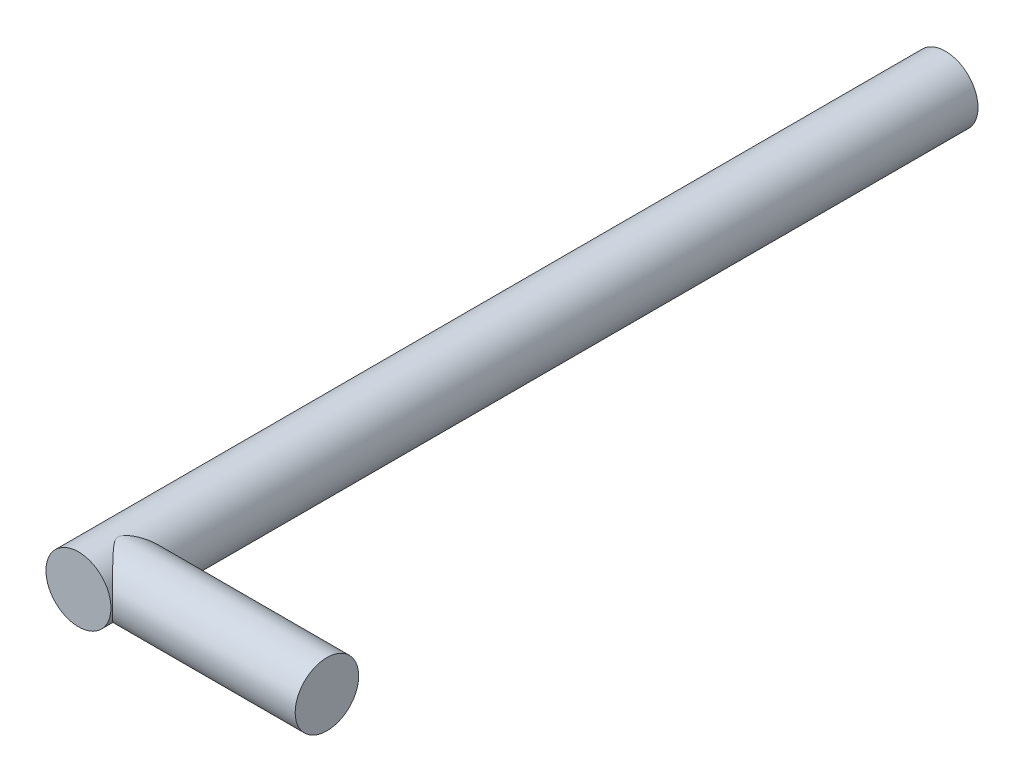
ISO-10303-21;
HEADER;
FILE_DESCRIPTION(('STEP AP214'),'2;1');
FILE_NAME('part.step','',(''),(''),'','','');
FILE_SCHEMA(('AUTOMOTIVE_DESIGN { 1 0 10303 214 1 1 1 1 }'));
ENDSEC;
DATA;
#1=APPLICATION_CONTEXT('core data for automotive mechanical design processes');
#2=APPLICATION_PROTOCOL_DEFINITION('international standard','automotive_design',2000,#1);
#3=PRODUCT_CONTEXT('',#1,'mechanical');
#4=PRODUCT('Part','Part','',(#3));
#5=PRODUCT_RELATED_PRODUCT_CATEGORY('part','',(#4));
#6=PRODUCT_DEFINITION_FORMATION('','',#4);
#7=PRODUCT_DEFINITION_CONTEXT('part definition',#1,'design');
#8=PRODUCT_DEFINITION('design','',#6,#7);
#9=PRODUCT_DEFINITION_SHAPE('','',#8);
#10=(LENGTH_UNIT() NAMED_UNIT(*) SI_UNIT(.MILLI.,.METRE.));
#11=(NAMED_UNIT(*) PLANE_ANGLE_UNIT() SI_UNIT($,.RADIAN.));
#12=(NAMED_UNIT(*) SI_UNIT($,.STERADIAN.) SOLID_ANGLE_UNIT());
#13=UNCERTAINTY_MEASURE_WITH_UNIT(LENGTH_MEASURE(1.E-05),#10,'distance_accuracy_value','');
#14=(GEOMETRIC_REPRESENTATION_CONTEXT(3) GLOBAL_UNCERTAINTY_ASSIGNED_CONTEXT((#13)) GLOBAL_UNIT_ASSIGNED_CONTEXT((#10,
#11,#12)) REPRESENTATION_CONTEXT('',''));
#15=CARTESIAN_POINT('',(0.,0.,0.));
#16=DIRECTION('',(0.,0.,1.));
#17=DIRECTION('',(1.,0.,0.));
#18=AXIS2_PLACEMENT_3D('',#15,#16,#17);
#19=CARTESIAN_POINT('',(-77.0476658214802,20.4872292069839,40.));
#20=DIRECTION('',(0.,0.,1.));
#21=DIRECTION('',(1.,0.,0.));
#22=AXIS2_PLACEMENT_3D('',#19,#20,#21);
#23=PLANE('',#22);
#24=CARTESIAN_POINT('',(-77.0476658214802,20.4872292069839,40.));
#25=DIRECTION('',(0.,0.,1.));
#26=DIRECTION('',(1.,0.,0.));
#27=AXIS2_PLACEMENT_3D('',#24,#25,#26);
#28=CIRCLE('',#27,1.5);
#29=CARTESIAN_POINT('',(-75.5476658214802,20.4872292069839,40.));
#30=VERTEX_POINT('',#29);
#31=EDGE_CURVE('E10',#30,#30,#28,.T.);
#32=ORIENTED_EDGE('',*,*,#31,.T.);
#33=EDGE_LOOP('',(#32));
#34=FACE_BOUND('',#33,.T.);
#35=ADVANCED_FACE('F36',(#34),#23,.T.);
#36=CARTESIAN_POINT('',(-77.0476658214802,20.4872292069839,40.));
#37=DIRECTION('',(0.,0.,-1.));
#38=DIRECTION('',(-1.,0.,0.));
#39=AXIS2_PLACEMENT_3D('',#36,#37,#38);
#40=CYLINDRICAL_SURFACE('',#39,1.5);
#41=CARTESIAN_POINT('',(-75.5476799469463,20.4937389073502,39.9298410910439));
#42=CARTESIAN_POINT('',(-75.5479721588343,20.5596938209896,39.9298351016306));
#43=CARTESIAN_POINT('',(-75.5526449940579,20.6257147585923,39.9253448948273));
#44=CARTESIAN_POINT('',(-75.5703887130748,20.7554930413982,39.9077616680322));
#45=CARTESIAN_POINT('',(-75.5834766403047,20.8192455150154,39.8946511878197));
#46=CARTESIAN_POINT('',(-75.6169137637388,20.9421788469985,39.8609631672997));
#47=CARTESIAN_POINT('',(-75.6372113105001,21.0013886713456,39.8404387230406));
#48=CARTESIAN_POINT('',(-75.6838144894128,21.1146594641907,39.7931661695607));
#49=CARTESIAN_POINT('',(-75.7101207071323,21.1687199301359,39.7664174537559));
#50=CARTESIAN_POINT('',(-75.779364496816,21.2923950734623,39.6958187716182));
#51=CARTESIAN_POINT('',(-75.8246890676155,21.3592428158619,39.6494633248249));
#52=CARTESIAN_POINT('',(-75.9220065723698,21.4817388627012,39.5494330218324));
#53=CARTESIAN_POINT('',(-75.9740179070548,21.5373551318538,39.4957379415387));
#54=CARTESIAN_POINT('',(-76.1027273254358,21.6565752202172,39.3619315326637));
#55=CARTESIAN_POINT('',(-76.18139264916,21.7154095709669,39.2794419636486));
#56=CARTESIAN_POINT('',(-76.301675141989,21.7894268125069,39.1502719869542));
#57=CARTESIAN_POINT('',(-76.3421332282473,21.8117207009847,39.1063282666292));
#58=CARTESIAN_POINT('',(-76.4231641795826,21.8517912519272,39.0164603944648));
#59=CARTESIAN_POINT('',(-76.4637370638758,21.8695671065823,38.9705358901823));
#60=CARTESIAN_POINT('',(-76.5293940429712,21.895121164319,38.8929791960203));
#61=CARTESIAN_POINT('',(-76.5548487683759,21.9042054259665,38.8620810617307));
#62=CARTESIAN_POINT('',(-76.6044998111904,21.9205048582407,38.7988400212673));
#63=CARTESIAN_POINT('',(-76.6286977524178,21.9277224911935,38.7664990850925));
#64=CARTESIAN_POINT('',(-76.6682292670931,21.9385498333965,38.7083399501743));
#65=CARTESIAN_POINT('',(-76.6842161965079,21.9426089768065,38.6830546925923));
#66=CARTESIAN_POINT('',(-76.7131855277429,21.9495358241719,38.6306333641963));
#67=CARTESIAN_POINT('',(-76.7261775473471,21.9524073662399,38.6035035908395));
#68=CARTESIAN_POINT('',(-76.7421508759393,21.9557997808392,38.5585756366731));
#69=CARTESIAN_POINT('',(-76.7470519958165,21.9568017152774,38.5415243042844));
#70=CARTESIAN_POINT('',(-76.7539947951254,21.9582052038159,38.5068497683467));
#71=CARTESIAN_POINT('',(-76.7560462092412,21.9586088021703,38.4892287231363));
#72=CARTESIAN_POINT('',(-76.7568613236165,21.9587702968742,38.4538112832337));
#73=CARTESIAN_POINT('',(-76.7556080726844,21.9585248640167,38.4360144527827));
#74=CARTESIAN_POINT('',(-76.7500655392383,21.9574133480806,38.4009039532156));
#75=CARTESIAN_POINT('',(-76.7457679341581,21.9565455635543,38.3835917441132));
#76=CARTESIAN_POINT('',(-76.7315367534001,21.9535647218607,38.3392010431341));
#77=CARTESIAN_POINT('',(-76.7197597122769,21.9510125066107,38.3127695263043));
#78=CARTESIAN_POINT('',(-76.6930399966,21.9447726948826,38.2616696678269));
#79=CARTESIAN_POINT('',(-76.6780805344444,21.9410790284239,38.2370116427505));
#80=CARTESIAN_POINT('',(-76.6332815761481,21.9291641495512,38.1687250811588));
#81=CARTESIAN_POINT('',(-76.6015136874579,21.9197485792199,38.1265938168351));
#82=CARTESIAN_POINT('',(-76.5361734764134,21.8977569953435,38.0445786975457));
#83=CARTESIAN_POINT('',(-76.5025972448297,21.8851738995513,38.0047001273266));
#84=CARTESIAN_POINT('',(-76.4348282972573,21.8568201433222,37.926482414439));
#85=CARTESIAN_POINT('',(-76.4006345783267,21.8410437729929,37.8881461789343));
#86=CARTESIAN_POINT('',(-76.3324200680731,21.8062785318354,37.8128957342931));
#87=CARTESIAN_POINT('',(-76.298399140851,21.7872928020946,37.7759801776574));
#88=CARTESIAN_POINT('',(-76.1973809378933,21.7254679359951,37.6674402588008));
#89=CARTESIAN_POINT('',(-76.1312054112052,21.6776716234388,37.5977739957619));
#90=CARTESIAN_POINT('',(-76.0041516721182,21.5680198783106,37.4651695423664));
#91=CARTESIAN_POINT('',(-75.943261069949,21.5061986276295,37.402215532229));
#92=CARTESIAN_POINT('',(-75.8448380338482,21.385870676808,37.3009692137909));
#93=CARTESIAN_POINT('',(-75.8053707997614,21.3307570793135,37.2605420845504));
#94=CARTESIAN_POINT('',(-75.7327702070602,21.2123874338603,37.186387843272));
#95=CARTESIAN_POINT('',(-75.6996302780359,21.1491399478271,37.1526537795682));
#96=CARTESIAN_POINT('',(-75.6467120843663,21.0266572630664,37.0989347417031));
#97=CARTESIAN_POINT('',(-75.6256166840529,20.9685971439572,37.0775836328375));
#98=CARTESIAN_POINT('',(-75.5904222135929,20.8482823641264,37.0420797662037));
#99=CARTESIAN_POINT('',(-75.5763183054505,20.7860306379029,37.0279220305718));
#100=CARTESIAN_POINT('',(-75.5560780994908,20.6585499540043,37.0077735690568));
#101=CARTESIAN_POINT('',(-75.5499874621229,20.5933061081803,37.0018296367032));
#102=CARTESIAN_POINT('',(-75.5464440320806,20.4623797615291,36.9987837424363));
#103=CARTESIAN_POINT('',(-75.5489892358954,20.3966973659739,37.0016797296505));
#104=CARTESIAN_POINT('',(-75.5618324499319,20.2732364277844,37.0153920328044));
#105=CARTESIAN_POINT('',(-75.5713875174968,20.2152908709819,37.0254467949008));
#106=CARTESIAN_POINT('',(-75.5967336291635,20.1023275992837,37.0519739363914));
#107=CARTESIAN_POINT('',(-75.6125260545307,20.0473105359683,37.0684477372735));
#108=CARTESIAN_POINT('',(-75.65066552944,19.9377053468397,37.1081989231749));
#109=CARTESIAN_POINT('',(-75.6733741778789,19.88338139504,37.1318512915685));
#110=CARTESIAN_POINT('',(-75.7237090033255,19.7797970166142,37.1843330862025));
#111=CARTESIAN_POINT('',(-75.7513368648116,19.7305383336241,37.2131642858522));
#112=CARTESIAN_POINT('',(-75.8272189024419,19.6108814905879,37.2925413809849));
#113=CARTESIAN_POINT('',(-75.878298211394,19.544294181467,37.34614297215));
#114=CARTESIAN_POINT('',(-75.9868033440728,19.4236563388789,37.4608718420956));
#115=CARTESIAN_POINT('',(-76.0442531498887,19.3696557283074,37.5220276648565));
#116=CARTESIAN_POINT('',(-76.1419921357276,19.2904780916702,37.6276238947505));
#117=CARTESIAN_POINT('',(-76.1812745138539,19.2618183509167,37.6704509343872));
#118=CARTESIAN_POINT('',(-76.2606816022818,19.2093723264666,37.7583677196011));
#119=CARTESIAN_POINT('',(-76.3008071835757,19.1855913857688,37.8034598792738));
#120=CARTESIAN_POINT('',(-76.3807862288947,19.142861696394,37.8958090130498));
#121=CARTESIAN_POINT('',(-76.420640150555,19.1238982595351,37.9430588757953));
#122=CARTESIAN_POINT('',(-76.4986986006214,19.0906614518,38.0404238180436));
#123=CARTESIAN_POINT('',(-76.5369064071477,19.076378346052,38.0905326925761));
#124=CARTESIAN_POINT('',(-76.5900065089589,19.0586266704941,38.1694145272976));
#125=CARTESIAN_POINT('',(-76.6070087423861,19.0533206466805,38.1963362153293));
#126=CARTESIAN_POINT('',(-76.6383662869649,19.0440604690508,38.2519177080751));
#127=CARTESIAN_POINT('',(-76.6527266891631,19.0401037022566,38.2805740252347));
#128=CARTESIAN_POINT('',(-76.6728322261315,19.0347921487044,38.3306553261389));
#129=CARTESIAN_POINT('',(-76.6798656268215,19.0330102033205,38.3514995550933));
#130=CARTESIAN_POINT('',(-76.6906213240394,19.0303315574542,38.3940597559954));
#131=CARTESIAN_POINT('',(-76.6943542288307,19.0294320197598,38.4157726988224));
#132=CARTESIAN_POINT('',(-76.6977342133839,19.0286160965533,38.4597582704986));
#133=CARTESIAN_POINT('',(-76.6973434507314,19.0287088169874,38.4820342082367));
#134=CARTESIAN_POINT('',(-76.6924786993367,19.0298867143185,38.5261175478962));
#135=CARTESIAN_POINT('',(-76.6879965191156,19.0309738822204,38.5479239200085));
#136=CARTESIAN_POINT('',(-76.6732571126157,19.03468159022,38.599867659259));
#137=CARTESIAN_POINT('',(-76.6613308392769,19.0377650098393,38.6294737445321));
#138=CARTESIAN_POINT('',(-76.6337931276288,19.0453844097802,38.6867673278502));
#139=CARTESIAN_POINT('',(-76.618162100245,19.0499281587647,38.7144435789485));
#140=CARTESIAN_POINT('',(-76.574454538399,19.0635479253402,38.7853212015124));
#141=CARTESIAN_POINT('',(-76.544750190871,19.0736743905411,38.827294960058));
#142=CARTESIAN_POINT('',(-76.4833395470085,19.0970374608563,38.9088847248126));
#143=CARTESIAN_POINT('',(-76.4516291441266,19.110280607283,38.9484955494553));
#144=CARTESIAN_POINT('',(-76.3874264509367,19.1398851469491,39.0260618058374));
#145=CARTESIAN_POINT('',(-76.354932416439,19.156254192677,39.0640128881632));
#146=CARTESIAN_POINT('',(-76.2899965777458,19.1921173680118,39.1383793484732));
#147=CARTESIAN_POINT('',(-76.2575547528201,19.2116086943801,39.1747960673377));
#148=CARTESIAN_POINT('',(-76.1905498686321,19.2555298951247,39.2490763134522));
#149=CARTESIAN_POINT('',(-76.1560280023394,19.2802320013235,39.2868178717795));
#150=CARTESIAN_POINT('',(-76.0880601652708,19.3335278717829,39.3604780183894));
#151=CARTESIAN_POINT('',(-76.0546146422614,19.362123230438,39.396395851489));
#152=CARTESIAN_POINT('',(-75.9567990731705,19.4538057648097,39.5008386313118));
#153=CARTESIAN_POINT('',(-75.8946401094263,19.5229844265774,39.5663909268713));
#154=CARTESIAN_POINT('',(-75.799853066974,19.6523102207951,39.6658693850568));
#155=CARTESIAN_POINT('',(-75.7642780412346,19.7078121710345,39.7030640104585));
#156=CARTESIAN_POINT('',(-75.6994718287132,19.8262374784655,39.7707081203127));
#157=CARTESIAN_POINT('',(-75.6702357814166,19.8891550920254,39.8011627731223));
#158=CARTESIAN_POINT('',(-75.6239307140765,20.011248736492,39.8494130982463));
#159=CARTESIAN_POINT('',(-75.6056767033873,20.0694854625673,39.8684407920167));
#160=CARTESIAN_POINT('',(-75.5762203292489,20.1895018687365,39.8992317161179));
#161=CARTESIAN_POINT('',(-75.5650018300521,20.2512730845677,39.9110115679868));
#162=CARTESIAN_POINT('',(-75.5542546138252,20.3436253978307,39.92243875369));
#163=CARTESIAN_POINT('',(-75.5516809890028,20.3735135984677,39.9252085253111));
#164=CARTESIAN_POINT('',(-75.5483267264098,20.4335095461601,39.9289112692884));
#165=CARTESIAN_POINT('',(-75.5475464939676,20.4636173413044,39.929843826405));
#166=CARTESIAN_POINT('',(-75.5476799469463,20.4937389073502,39.9298410910439));
#167=B_SPLINE_CURVE_WITH_KNOTS('',3,(#41,#42,#43,#44,#45,#46,#47,#48,#49,#50,#51,#52,#53,#54,
#55,#56,#57,#58,#59,#60,#61,#62,#63,#64,#65,#66,#67,#68,#69,#70,#71,#72,#73,#74,#75,#76,#77,#78,
#79,#80,#81,#82,#83,#84,#85,#86,#87,#88,#89,#90,#91,#92,#93,#94,#95,#96,#97,#98,#99,#100,#101,
#102,#103,#104,#105,#106,#107,#108,#109,#110,#111,#112,#113,#114,#115,#116,#117,#118,#119,#120,
#121,#122,#123,#124,#125,#126,#127,#128,#129,#130,#131,#132,#133,#134,#135,#136,#137,#138,#139,
#140,#141,#142,#143,#144,#145,#146,#147,#148,#149,#150,#151,#152,#153,#154,#155,#156,#157,#158,
#159,#160,#161,#162,#163,#164,#165,#166),.UNSPECIFIED.,.T.,.F.,(4,2,2,2,2,2,2,2,2,2,2,2,2,2,2,2,
2,2,2,2,2,2,2,2,2,2,2,2,2,2,2,2,2,2,2,2,2,2,2,2,2,2,2,2,2,2,2,2,2,2,2,2,2,2,2,2,2,2,2,2,2,2,4),
(0.,0.19773072949822,0.395863198191216,0.592603969089298,0.78936392132015,1.06718103518518,
1.34577970388857,1.72838700671901,1.9195360567916,2.11071925968003,2.23382222275011,
2.35676195902958,2.4472350072603,2.53741333399857,2.59053292675109,2.64347061133266,
2.69668036593298,2.7500361479868,2.83668673464828,2.9238062782858,3.08423715521129,
3.24502997489942,3.40611288920741,3.56703905054689,3.8878623569715,4.20791198965238,
4.44391234233489,4.67966627815982,4.87494929040125,5.07009698076865,5.26635189503507,
5.46256128137477,5.64052514602553,5.81852844296371,6.0081919267276,6.19792048200705,
6.49501062650323,6.793259802058,6.98744060700914,7.1818329462915,7.37562528657135,
7.56901195072446,7.66575900590441,7.76231762179237,7.8283251396659,7.89411972055031,
7.96051861180015,8.02705073338714,8.12270436958593,8.21887552938099,8.37575229552461,
8.53296129917021,8.69056021652892,8.84801842377898,9.01823888667105,9.1885292704155,
9.52763072367177,9.75398064762208,9.98015639546567,10.1711652831759,10.3617344797363,
10.4520175718762,10.5423210670855),.UNSPECIFIED.);
#168=CARTESIAN_POINT('',(-75.5476799469463,20.4937389073502,39.9298410910439));
#169=VERTEX_POINT('',#168);
#170=EDGE_CURVE('E41',#169,#169,#167,.T.);
#171=ORIENTED_EDGE('',*,*,#170,.T.);
#172=EDGE_LOOP('',(#171));
#173=FACE_BOUND('',#172,.T.);
#174=ORIENTED_EDGE('',*,*,#31,.F.);
#175=EDGE_LOOP('',(#174));
#176=FACE_BOUND('',#175,.T.);
#177=CARTESIAN_POINT('',(-77.0476658214802,20.4872292069839,0.));
#178=DIRECTION('',(0.,0.,1.));
#179=DIRECTION('',(1.,0.,0.));
#180=AXIS2_PLACEMENT_3D('',#177,#178,#179);
#181=CIRCLE('',#180,1.5);
#182=CARTESIAN_POINT('',(-75.5476658214802,20.4872292069839,0.));
#183=VERTEX_POINT('',#182);
#184=EDGE_CURVE('E49',#183,#183,#181,.T.);
#185=ORIENTED_EDGE('',*,*,#184,.T.);
#186=EDGE_LOOP('',(#185));
#187=FACE_BOUND('',#186,.T.);
#188=ADVANCED_FACE('F38',(#173,#176,#187),#40,.T.);
#189=CARTESIAN_POINT('',(-77.0476658214802,20.4872292069839,0.));
#190=DIRECTION('',(0.,0.,1.));
#191=DIRECTION('',(1.,0.,0.));
#192=AXIS2_PLACEMENT_3D('',#189,#190,#191);
#193=PLANE('',#192);
#194=ORIENTED_EDGE('',*,*,#184,.F.);
#195=EDGE_LOOP('',(#194));
#196=FACE_BOUND('',#195,.T.);
#197=ADVANCED_FACE('F67',(#196),#193,.F.);
#198=CARTESIAN_POINT('',(-67.1193507568104,20.4937389073502,38.4648753802231));
#199=DIRECTION('',(-1.,0.,0.));
#200=DIRECTION('',(0.,0.,1.));
#201=AXIS2_PLACEMENT_3D('',#198,#199,#200);
#202=CYLINDRICAL_SURFACE('',#201,1.46496571082073);
#203=CARTESIAN_POINT('',(-67.1193507568104,20.4937389073502,38.4648753802231));
#204=DIRECTION('',(-1.,0.,0.));
#205=DIRECTION('',(0.,0.,1.));
#206=AXIS2_PLACEMENT_3D('',#203,#204,#205);
#207=CIRCLE('',#206,1.46496571082073);
#208=CARTESIAN_POINT('',(-67.1193507568104,20.4937389073502,39.9298410910439));
#209=VERTEX_POINT('',#208);
#210=EDGE_CURVE('E55',#209,#209,#207,.T.);
#211=ORIENTED_EDGE('',*,*,#210,.T.);
#212=EDGE_LOOP('',(#211));
#213=FACE_BOUND('',#212,.T.);
#214=ORIENTED_EDGE('',*,*,#170,.F.);
#215=EDGE_LOOP('',(#214));
#216=FACE_BOUND('',#215,.T.);
#217=ADVANCED_FACE('F64',(#213,#216),#202,.T.);
#218=CARTESIAN_POINT('',(-67.1193507568104,20.4937389073502,38.4648753802231));
#219=DIRECTION('',(-1.,0.,0.));
#220=DIRECTION('',(0.,0.,1.));
#221=AXIS2_PLACEMENT_3D('',#218,#219,#220);
#222=PLANE('',#221);
#223=ORIENTED_EDGE('',*,*,#210,.F.);
#224=EDGE_LOOP('',(#223));
#225=FACE_BOUND('',#224,.T.);
#226=ADVANCED_FACE('F66',(#225),#222,.F.);
#227=CLOSED_SHELL('',(#35,#188,#197,#217,#226));
#228=MANIFOLD_SOLID_BREP('B2',#227);
#229=ADVANCED_BREP_SHAPE_REPRESENTATION('',(#18,#228),#14);
#230=SHAPE_DEFINITION_REPRESENTATION(#9,#229);
ENDSEC;
END-ISO-10303-21;
